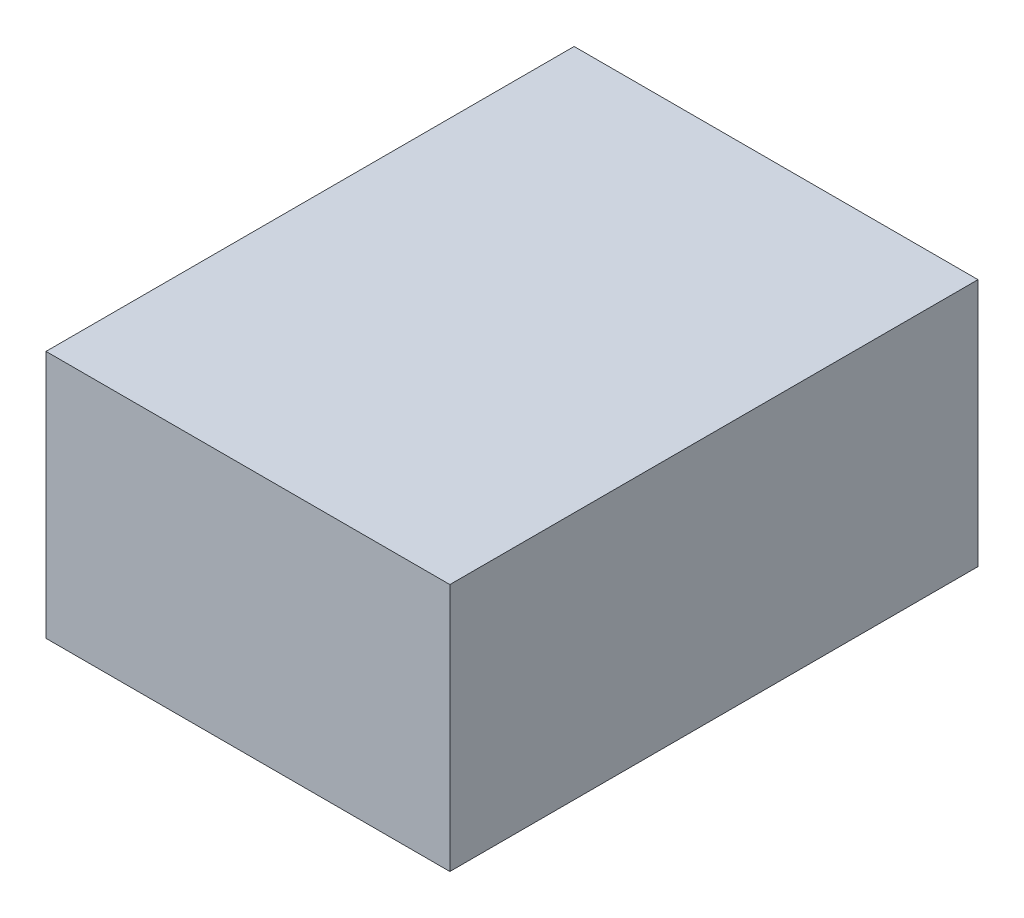
ISO-10303-21;
HEADER;
FILE_DESCRIPTION(('STEP AP214'),'2;1');
FILE_NAME('part.step','',(''),(''),'','','');
FILE_SCHEMA(('AUTOMOTIVE_DESIGN { 1 0 10303 214 1 1 1 1 }'));
ENDSEC;
DATA;
#1=APPLICATION_CONTEXT('core data for automotive mechanical design processes');
#2=APPLICATION_PROTOCOL_DEFINITION('international standard','automotive_design',2000,#1);
#3=PRODUCT_CONTEXT('',#1,'mechanical');
#4=PRODUCT('Part','Part','',(#3));
#5=PRODUCT_RELATED_PRODUCT_CATEGORY('part','',(#4));
#6=PRODUCT_DEFINITION_FORMATION('','',#4);
#7=PRODUCT_DEFINITION_CONTEXT('part definition',#1,'design');
#8=PRODUCT_DEFINITION('design','',#6,#7);
#9=PRODUCT_DEFINITION_SHAPE('','',#8);
#10=(LENGTH_UNIT() NAMED_UNIT(*) SI_UNIT(.MILLI.,.METRE.));
#11=(NAMED_UNIT(*) PLANE_ANGLE_UNIT() SI_UNIT($,.RADIAN.));
#12=(NAMED_UNIT(*) SI_UNIT($,.STERADIAN.) SOLID_ANGLE_UNIT());
#13=UNCERTAINTY_MEASURE_WITH_UNIT(LENGTH_MEASURE(1.E-05),#10,'distance_accuracy_value','');
#14=(GEOMETRIC_REPRESENTATION_CONTEXT(3) GLOBAL_UNCERTAINTY_ASSIGNED_CONTEXT((#13)) GLOBAL_UNIT_ASSIGNED_CONTEXT((#10,
#11,#12)) REPRESENTATION_CONTEXT('',''));
#15=CARTESIAN_POINT('',(0.,0.,0.));
#16=DIRECTION('',(0.,0.,1.));
#17=DIRECTION('',(1.,0.,0.));
#18=AXIS2_PLACEMENT_3D('',#15,#16,#17);
#19=CARTESIAN_POINT('',(0.,0.,0.));
#20=DIRECTION('',(0.,1.,0.));
#21=DIRECTION('',(1.,0.,0.));
#22=AXIS2_PLACEMENT_3D('',#19,#20,#21);
#23=PLANE('',#22);
#24=DIRECTION('',(0.,0.,-1.));
#25=VECTOR('',#24,1.);
#26=CARTESIAN_POINT('',(0.65,0.,-0.85));
#27=LINE('',#26,#25);
#28=CARTESIAN_POINT('',(0.65,0.,0.85));
#29=VERTEX_POINT('',#28);
#30=CARTESIAN_POINT('',(0.65,0.,-0.85));
#31=VERTEX_POINT('',#30);
#32=EDGE_CURVE('E110',#29,#31,#27,.T.);
#33=ORIENTED_EDGE('',*,*,#32,.F.);
#34=DIRECTION('',(1.,0.,0.));
#35=VECTOR('',#34,1.);
#36=CARTESIAN_POINT('',(-0.65,0.,0.85));
#37=LINE('',#36,#35);
#38=CARTESIAN_POINT('',(-0.65,0.,0.85));
#39=VERTEX_POINT('',#38);
#40=EDGE_CURVE('E26',#39,#29,#37,.T.);
#41=ORIENTED_EDGE('',*,*,#40,.F.);
#42=DIRECTION('',(0.,0.,1.));
#43=VECTOR('',#42,1.);
#44=CARTESIAN_POINT('',(-0.65,0.,-0.85));
#45=LINE('',#44,#43);
#46=CARTESIAN_POINT('',(-0.65,0.,-0.85));
#47=VERTEX_POINT('',#46);
#48=EDGE_CURVE('E66',#47,#39,#45,.T.);
#49=ORIENTED_EDGE('',*,*,#48,.F.);
#50=DIRECTION('',(-1.,0.,0.));
#51=VECTOR('',#50,1.);
#52=CARTESIAN_POINT('',(-0.65,0.,-0.85));
#53=LINE('',#52,#51);
#54=EDGE_CURVE('E94',#31,#47,#53,.T.);
#55=ORIENTED_EDGE('',*,*,#54,.F.);
#56=EDGE_LOOP('',(#33,#41,#49,#55));
#57=FACE_BOUND('',#56,.T.);
#58=ADVANCED_FACE('F16',(#57),#23,.F.);
#59=CARTESIAN_POINT('',(0.,0.8,0.));
#60=DIRECTION('',(0.,1.,0.));
#61=DIRECTION('',(1.,0.,0.));
#62=AXIS2_PLACEMENT_3D('',#59,#60,#61);
#63=PLANE('',#62);
#64=DIRECTION('',(0.,0.,-1.));
#65=VECTOR('',#64,1.);
#66=CARTESIAN_POINT('',(0.65,0.8,-0.85));
#67=LINE('',#66,#65);
#68=CARTESIAN_POINT('',(0.65,0.8,0.85));
#69=VERTEX_POINT('',#68);
#70=CARTESIAN_POINT('',(0.65,0.8,-0.85));
#71=VERTEX_POINT('',#70);
#72=EDGE_CURVE('E19',#69,#71,#67,.T.);
#73=ORIENTED_EDGE('',*,*,#72,.T.);
#74=DIRECTION('',(-1.,0.,0.));
#75=VECTOR('',#74,1.);
#76=CARTESIAN_POINT('',(-0.65,0.8,-0.85));
#77=LINE('',#76,#75);
#78=CARTESIAN_POINT('',(-0.65,0.8,-0.85));
#79=VERTEX_POINT('',#78);
#80=EDGE_CURVE('E85',#71,#79,#77,.T.);
#81=ORIENTED_EDGE('',*,*,#80,.T.);
#82=DIRECTION('',(0.,0.,1.));
#83=VECTOR('',#82,1.);
#84=CARTESIAN_POINT('',(-0.65,0.8,-0.85));
#85=LINE('',#84,#83);
#86=CARTESIAN_POINT('',(-0.65,0.8,0.85));
#87=VERTEX_POINT('',#86);
#88=EDGE_CURVE('E74',#79,#87,#85,.T.);
#89=ORIENTED_EDGE('',*,*,#88,.T.);
#90=DIRECTION('',(1.,0.,0.));
#91=VECTOR('',#90,1.);
#92=CARTESIAN_POINT('',(-0.65,0.8,0.85));
#93=LINE('',#92,#91);
#94=EDGE_CURVE('E11',#87,#69,#93,.T.);
#95=ORIENTED_EDGE('',*,*,#94,.T.);
#96=EDGE_LOOP('',(#73,#81,#89,#95));
#97=FACE_BOUND('',#96,.T.);
#98=ADVANCED_FACE('F86',(#97),#63,.T.);
#99=CARTESIAN_POINT('',(-0.65,0.8,0.85));
#100=DIRECTION('',(0.,0.,-1.));
#101=DIRECTION('',(0.,-1.,0.));
#102=AXIS2_PLACEMENT_3D('',#99,#100,#101);
#103=PLANE('',#102);
#104=ORIENTED_EDGE('',*,*,#40,.T.);
#105=DIRECTION('',(0.,-1.,0.));
#106=VECTOR('',#105,1.);
#107=CARTESIAN_POINT('',(0.65,0.8,0.85));
#108=LINE('',#107,#106);
#109=EDGE_CURVE('E101',#69,#29,#108,.T.);
#110=ORIENTED_EDGE('',*,*,#109,.F.);
#111=ORIENTED_EDGE('',*,*,#94,.F.);
#112=DIRECTION('',(0.,-1.,0.));
#113=VECTOR('',#112,1.);
#114=CARTESIAN_POINT('',(-0.65,0.8,0.85));
#115=LINE('',#114,#113);
#116=EDGE_CURVE('E80',#87,#39,#115,.T.);
#117=ORIENTED_EDGE('',*,*,#116,.T.);
#118=EDGE_LOOP('',(#104,#110,#111,#117));
#119=FACE_BOUND('',#118,.T.);
#120=ADVANCED_FACE('F170',(#119),#103,.F.);
#121=CARTESIAN_POINT('',(-0.65,0.8,-0.85));
#122=DIRECTION('',(1.,0.,0.));
#123=DIRECTION('',(0.,0.,-1.));
#124=AXIS2_PLACEMENT_3D('',#121,#122,#123);
#125=PLANE('',#124);
#126=ORIENTED_EDGE('',*,*,#48,.T.);
#127=ORIENTED_EDGE('',*,*,#116,.F.);
#128=ORIENTED_EDGE('',*,*,#88,.F.);
#129=DIRECTION('',(0.,-1.,0.));
#130=VECTOR('',#129,1.);
#131=CARTESIAN_POINT('',(-0.65,0.8,-0.85));
#132=LINE('',#131,#130);
#133=EDGE_CURVE('E78',#79,#47,#132,.T.);
#134=ORIENTED_EDGE('',*,*,#133,.T.);
#135=EDGE_LOOP('',(#126,#127,#128,#134));
#136=FACE_BOUND('',#135,.T.);
#137=ADVANCED_FACE('F76',(#136),#125,.F.);
#138=CARTESIAN_POINT('',(-0.65,0.8,-0.85));
#139=DIRECTION('',(0.,0.,1.));
#140=DIRECTION('',(1.,0.,0.));
#141=AXIS2_PLACEMENT_3D('',#138,#139,#140);
#142=PLANE('',#141);
#143=ORIENTED_EDGE('',*,*,#54,.T.);
#144=ORIENTED_EDGE('',*,*,#133,.F.);
#145=ORIENTED_EDGE('',*,*,#80,.F.);
#146=DIRECTION('',(0.,-1.,0.));
#147=VECTOR('',#146,1.);
#148=CARTESIAN_POINT('',(0.65,0.8,-0.85));
#149=LINE('',#148,#147);
#150=EDGE_CURVE('E107',#71,#31,#149,.T.);
#151=ORIENTED_EDGE('',*,*,#150,.T.);
#152=EDGE_LOOP('',(#143,#144,#145,#151));
#153=FACE_BOUND('',#152,.T.);
#154=ADVANCED_FACE('F93',(#153),#142,.F.);
#155=CARTESIAN_POINT('',(0.65,0.8,-0.85));
#156=DIRECTION('',(-1.,0.,0.));
#157=DIRECTION('',(0.,1.,0.));
#158=AXIS2_PLACEMENT_3D('',#155,#156,#157);
#159=PLANE('',#158);
#160=ORIENTED_EDGE('',*,*,#32,.T.);
#161=ORIENTED_EDGE('',*,*,#150,.F.);
#162=ORIENTED_EDGE('',*,*,#72,.F.);
#163=ORIENTED_EDGE('',*,*,#109,.T.);
#164=EDGE_LOOP('',(#160,#161,#162,#163));
#165=FACE_BOUND('',#164,.T.);
#166=ADVANCED_FACE('F174',(#165),#159,.F.);
#167=CLOSED_SHELL('',(#58,#98,#120,#137,#154,#166));
#168=MANIFOLD_SOLID_BREP('B1',#167);
#169=ADVANCED_BREP_SHAPE_REPRESENTATION('',(#18,#168),#14);
#170=SHAPE_DEFINITION_REPRESENTATION(#9,#169);
ENDSEC;
END-ISO-10303-21;
